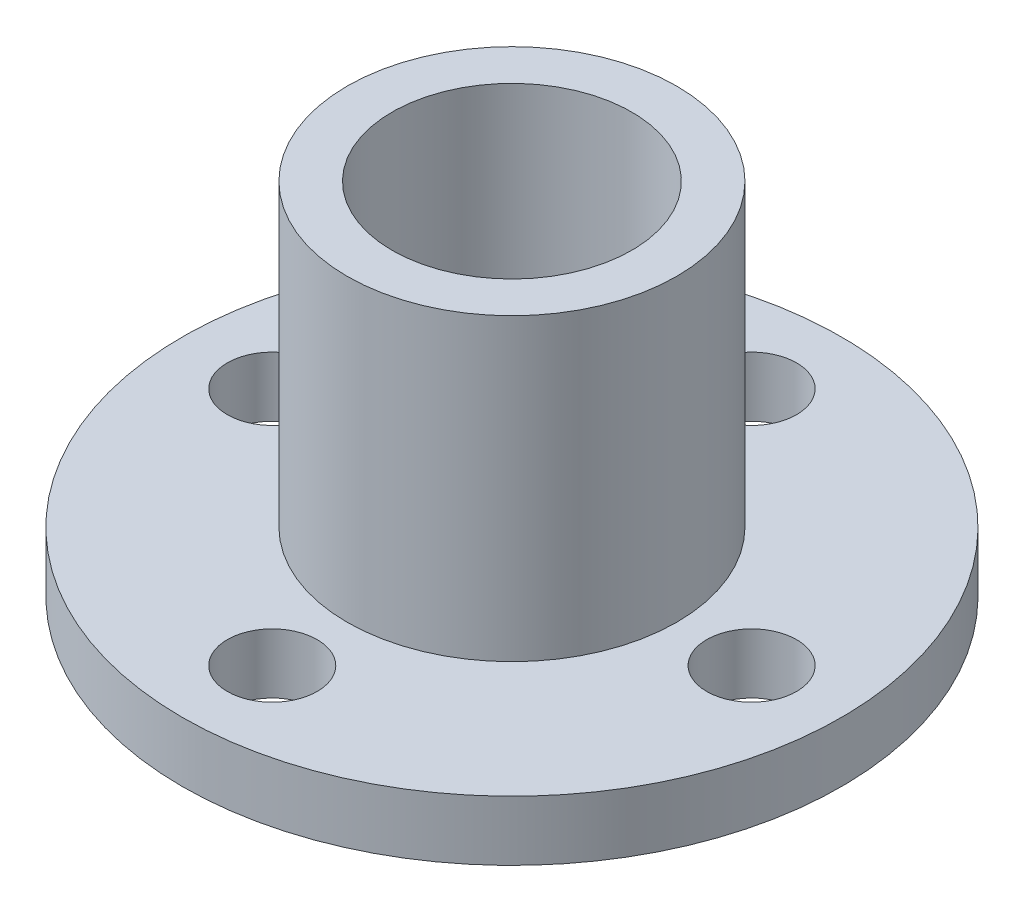
ISO-10303-21;
HEADER;
FILE_DESCRIPTION(('STEP AP214'),'2;1');
FILE_NAME('part.step','',(''),(''),'','','');
FILE_SCHEMA(('AUTOMOTIVE_DESIGN { 1 0 10303 214 1 1 1 1 }'));
ENDSEC;
DATA;
#1=APPLICATION_CONTEXT('core data for automotive mechanical design processes');
#2=APPLICATION_PROTOCOL_DEFINITION('international standard','automotive_design',2000,#1);
#3=PRODUCT_CONTEXT('',#1,'mechanical');
#4=PRODUCT('Part','Part','',(#3));
#5=PRODUCT_RELATED_PRODUCT_CATEGORY('part','',(#4));
#6=PRODUCT_DEFINITION_FORMATION('','',#4);
#7=PRODUCT_DEFINITION_CONTEXT('part definition',#1,'design');
#8=PRODUCT_DEFINITION('design','',#6,#7);
#9=PRODUCT_DEFINITION_SHAPE('','',#8);
#10=(LENGTH_UNIT() NAMED_UNIT(*) SI_UNIT(.MILLI.,.METRE.));
#11=(NAMED_UNIT(*) PLANE_ANGLE_UNIT() SI_UNIT($,.RADIAN.));
#12=(NAMED_UNIT(*) SI_UNIT($,.STERADIAN.) SOLID_ANGLE_UNIT());
#13=UNCERTAINTY_MEASURE_WITH_UNIT(LENGTH_MEASURE(1.E-05),#10,'distance_accuracy_value','');
#14=(GEOMETRIC_REPRESENTATION_CONTEXT(3) GLOBAL_UNCERTAINTY_ASSIGNED_CONTEXT((#13)) GLOBAL_UNIT_ASSIGNED_CONTEXT((#10,
#11,#12)) REPRESENTATION_CONTEXT('',''));
#15=CARTESIAN_POINT('',(0.,0.,0.));
#16=DIRECTION('',(0.,0.,1.));
#17=DIRECTION('',(1.,0.,0.));
#18=AXIS2_PLACEMENT_3D('',#15,#16,#17);
#19=CARTESIAN_POINT('',(0.,2.,0.));
#20=DIRECTION('',(0.,1.,0.));
#21=DIRECTION('',(0.,0.,1.));
#22=AXIS2_PLACEMENT_3D('',#19,#20,#21);
#23=PLANE('',#22);
#24=CARTESIAN_POINT('',(0.,2.,0.));
#25=DIRECTION('',(0.,1.,0.));
#26=DIRECTION('',(0.,0.,1.));
#27=AXIS2_PLACEMENT_3D('',#24,#25,#26);
#28=CIRCLE('',#27,11.);
#29=CARTESIAN_POINT('',(0.,2.,11.));
#30=VERTEX_POINT('',#29);
#31=EDGE_CURVE('E10',#30,#30,#28,.T.);
#32=ORIENTED_EDGE('',*,*,#31,.T.);
#33=EDGE_LOOP('',(#32));
#34=FACE_BOUND('',#33,.T.);
#35=CARTESIAN_POINT('',(8.,2.,0.));
#36=DIRECTION('',(0.,1.,0.));
#37=DIRECTION('',(0.,0.,1.));
#38=AXIS2_PLACEMENT_3D('',#35,#36,#37);
#39=CIRCLE('',#38,1.5);
#40=CARTESIAN_POINT('',(8.,2.,1.5));
#41=VERTEX_POINT('',#40);
#42=EDGE_CURVE('E47',#41,#41,#39,.T.);
#43=ORIENTED_EDGE('',*,*,#42,.F.);
#44=EDGE_LOOP('',(#43));
#45=FACE_BOUND('',#44,.T.);
#46=CARTESIAN_POINT('',(0.,2.,8.));
#47=DIRECTION('',(0.,1.,0.));
#48=DIRECTION('',(0.,0.,1.));
#49=AXIS2_PLACEMENT_3D('',#46,#47,#48);
#50=CIRCLE('',#49,1.5);
#51=CARTESIAN_POINT('',(0.,2.,9.5));
#52=VERTEX_POINT('',#51);
#53=EDGE_CURVE('E53',#52,#52,#50,.T.);
#54=ORIENTED_EDGE('',*,*,#53,.F.);
#55=EDGE_LOOP('',(#54));
#56=FACE_BOUND('',#55,.T.);
#57=CARTESIAN_POINT('',(0.,2.,-8.));
#58=DIRECTION('',(0.,1.,0.));
#59=DIRECTION('',(0.,0.,1.));
#60=AXIS2_PLACEMENT_3D('',#57,#58,#59);
#61=CIRCLE('',#60,1.5);
#62=CARTESIAN_POINT('',(0.,2.,-6.5));
#63=VERTEX_POINT('',#62);
#64=EDGE_CURVE('E60',#63,#63,#61,.T.);
#65=ORIENTED_EDGE('',*,*,#64,.F.);
#66=EDGE_LOOP('',(#65));
#67=FACE_BOUND('',#66,.T.);
#68=CARTESIAN_POINT('',(-8.,2.,0.));
#69=DIRECTION('',(0.,1.,0.));
#70=DIRECTION('',(0.,0.,1.));
#71=AXIS2_PLACEMENT_3D('',#68,#69,#70);
#72=CIRCLE('',#71,1.5);
#73=CARTESIAN_POINT('',(-8.,2.,1.5));
#74=VERTEX_POINT('',#73);
#75=EDGE_CURVE('E66',#74,#74,#72,.T.);
#76=ORIENTED_EDGE('',*,*,#75,.F.);
#77=EDGE_LOOP('',(#76));
#78=FACE_BOUND('',#77,.T.);
#79=CARTESIAN_POINT('',(0.,2.,0.));
#80=DIRECTION('',(0.,1.,0.));
#81=DIRECTION('',(0.,0.,1.));
#82=AXIS2_PLACEMENT_3D('',#79,#80,#81);
#83=CIRCLE('',#82,5.5);
#84=CARTESIAN_POINT('',(0.,2.,5.5));
#85=VERTEX_POINT('',#84);
#86=EDGE_CURVE('E71',#85,#85,#83,.T.);
#87=ORIENTED_EDGE('',*,*,#86,.F.);
#88=EDGE_LOOP('',(#87));
#89=FACE_BOUND('',#88,.T.);
#90=ADVANCED_FACE('F31',(#34,#45,#56,#67,#78,#89),#23,.T.);
#91=CARTESIAN_POINT('',(0.,0.,0.));
#92=DIRECTION('',(0.,1.,0.));
#93=DIRECTION('',(0.,0.,1.));
#94=AXIS2_PLACEMENT_3D('',#91,#92,#93);
#95=PLANE('',#94);
#96=CARTESIAN_POINT('',(-8.,0.,0.));
#97=DIRECTION('',(0.,1.,0.));
#98=DIRECTION('',(0.,0.,1.));
#99=AXIS2_PLACEMENT_3D('',#96,#97,#98);
#100=CIRCLE('',#99,1.5);
#101=CARTESIAN_POINT('',(-8.,0.,1.5));
#102=VERTEX_POINT('',#101);
#103=EDGE_CURVE('E50',#102,#102,#100,.T.);
#104=ORIENTED_EDGE('',*,*,#103,.T.);
#105=EDGE_LOOP('',(#104));
#106=FACE_BOUND('',#105,.T.);
#107=CARTESIAN_POINT('',(0.,0.,-8.));
#108=DIRECTION('',(0.,1.,0.));
#109=DIRECTION('',(0.,0.,1.));
#110=AXIS2_PLACEMENT_3D('',#107,#108,#109);
#111=CIRCLE('',#110,1.5);
#112=CARTESIAN_POINT('',(0.,0.,-6.5));
#113=VERTEX_POINT('',#112);
#114=EDGE_CURVE('E63',#113,#113,#111,.T.);
#115=ORIENTED_EDGE('',*,*,#114,.T.);
#116=EDGE_LOOP('',(#115));
#117=FACE_BOUND('',#116,.T.);
#118=CARTESIAN_POINT('',(0.,0.,8.));
#119=DIRECTION('',(0.,1.,0.));
#120=DIRECTION('',(0.,0.,1.));
#121=AXIS2_PLACEMENT_3D('',#118,#119,#120);
#122=CIRCLE('',#121,1.5);
#123=CARTESIAN_POINT('',(0.,0.,9.5));
#124=VERTEX_POINT('',#123);
#125=EDGE_CURVE('E56',#124,#124,#122,.T.);
#126=ORIENTED_EDGE('',*,*,#125,.T.);
#127=EDGE_LOOP('',(#126));
#128=FACE_BOUND('',#127,.T.);
#129=CARTESIAN_POINT('',(8.,0.,0.));
#130=DIRECTION('',(0.,1.,0.));
#131=DIRECTION('',(0.,0.,1.));
#132=AXIS2_PLACEMENT_3D('',#129,#130,#131);
#133=CIRCLE('',#132,1.5);
#134=CARTESIAN_POINT('',(8.,0.,1.5));
#135=VERTEX_POINT('',#134);
#136=EDGE_CURVE('E46',#135,#135,#133,.T.);
#137=ORIENTED_EDGE('',*,*,#136,.T.);
#138=EDGE_LOOP('',(#137));
#139=FACE_BOUND('',#138,.T.);
#140=CARTESIAN_POINT('',(0.,0.,0.));
#141=DIRECTION('',(0.,1.,0.));
#142=DIRECTION('',(0.,0.,1.));
#143=AXIS2_PLACEMENT_3D('',#140,#141,#142);
#144=CIRCLE('',#143,11.);
#145=CARTESIAN_POINT('',(0.,0.,11.));
#146=VERTEX_POINT('',#145);
#147=EDGE_CURVE('E35',#146,#146,#144,.T.);
#148=ORIENTED_EDGE('',*,*,#147,.F.);
#149=EDGE_LOOP('',(#148));
#150=FACE_BOUND('',#149,.T.);
#151=CARTESIAN_POINT('',(0.,0.,0.));
#152=DIRECTION('',(0.,1.,0.));
#153=DIRECTION('',(0.,0.,1.));
#154=AXIS2_PLACEMENT_3D('',#151,#152,#153);
#155=CIRCLE('',#154,4.);
#156=CARTESIAN_POINT('',(0.,0.,4.));
#157=VERTEX_POINT('',#156);
#158=EDGE_CURVE('E42',#157,#157,#155,.T.);
#159=ORIENTED_EDGE('',*,*,#158,.T.);
#160=EDGE_LOOP('',(#159));
#161=FACE_BOUND('',#160,.T.);
#162=ADVANCED_FACE('F98',(#106,#117,#128,#139,#150,#161),#95,.F.);
#163=CARTESIAN_POINT('',(0.,2.,0.));
#164=DIRECTION('',(0.,-1.,0.));
#165=DIRECTION('',(0.,0.,-1.));
#166=AXIS2_PLACEMENT_3D('',#163,#164,#165);
#167=CYLINDRICAL_SURFACE('',#166,11.);
#168=ORIENTED_EDGE('',*,*,#31,.F.);
#169=EDGE_LOOP('',(#168));
#170=FACE_BOUND('',#169,.T.);
#171=ORIENTED_EDGE('',*,*,#147,.T.);
#172=EDGE_LOOP('',(#171));
#173=FACE_BOUND('',#172,.T.);
#174=ADVANCED_FACE('F33',(#170,#173),#167,.T.);
#175=CARTESIAN_POINT('',(0.,2.,0.));
#176=DIRECTION('',(0.,-1.,0.));
#177=DIRECTION('',(0.,0.,-1.));
#178=AXIS2_PLACEMENT_3D('',#175,#176,#177);
#179=CYLINDRICAL_SURFACE('',#178,4.);
#180=ORIENTED_EDGE('',*,*,#158,.F.);
#181=EDGE_LOOP('',(#180));
#182=FACE_BOUND('',#181,.T.);
#183=CARTESIAN_POINT('',(0.,12.,0.));
#184=DIRECTION('',(0.,1.,0.));
#185=DIRECTION('',(0.,0.,1.));
#186=AXIS2_PLACEMENT_3D('',#183,#184,#185);
#187=CIRCLE('',#186,4.);
#188=CARTESIAN_POINT('',(0.,12.,4.));
#189=VERTEX_POINT('',#188);
#190=EDGE_CURVE('E74',#189,#189,#187,.T.);
#191=ORIENTED_EDGE('',*,*,#190,.T.);
#192=EDGE_LOOP('',(#191));
#193=FACE_BOUND('',#192,.T.);
#194=ADVANCED_FACE('F80',(#182,#193),#179,.F.);
#195=CARTESIAN_POINT('',(8.,0.,0.));
#196=DIRECTION('',(0.,1.,0.));
#197=DIRECTION('',(0.,0.,1.));
#198=AXIS2_PLACEMENT_3D('',#195,#196,#197);
#199=CYLINDRICAL_SURFACE('',#198,1.5);
#200=ORIENTED_EDGE('',*,*,#136,.F.);
#201=EDGE_LOOP('',(#200));
#202=FACE_BOUND('',#201,.T.);
#203=ORIENTED_EDGE('',*,*,#42,.T.);
#204=EDGE_LOOP('',(#203));
#205=FACE_BOUND('',#204,.T.);
#206=ADVANCED_FACE('F108',(#202,#205),#199,.F.);
#207=CARTESIAN_POINT('',(0.,0.,8.));
#208=DIRECTION('',(0.,1.,0.));
#209=DIRECTION('',(0.,0.,1.));
#210=AXIS2_PLACEMENT_3D('',#207,#208,#209);
#211=CYLINDRICAL_SURFACE('',#210,1.5);
#212=ORIENTED_EDGE('',*,*,#125,.F.);
#213=EDGE_LOOP('',(#212));
#214=FACE_BOUND('',#213,.T.);
#215=ORIENTED_EDGE('',*,*,#53,.T.);
#216=EDGE_LOOP('',(#215));
#217=FACE_BOUND('',#216,.T.);
#218=ADVANCED_FACE('F112',(#214,#217),#211,.F.);
#219=CARTESIAN_POINT('',(0.,0.,-8.));
#220=DIRECTION('',(0.,1.,0.));
#221=DIRECTION('',(0.,0.,1.));
#222=AXIS2_PLACEMENT_3D('',#219,#220,#221);
#223=CYLINDRICAL_SURFACE('',#222,1.5);
#224=ORIENTED_EDGE('',*,*,#114,.F.);
#225=EDGE_LOOP('',(#224));
#226=FACE_BOUND('',#225,.T.);
#227=ORIENTED_EDGE('',*,*,#64,.T.);
#228=EDGE_LOOP('',(#227));
#229=FACE_BOUND('',#228,.T.);
#230=ADVANCED_FACE('F94',(#226,#229),#223,.F.);
#231=CARTESIAN_POINT('',(-8.,0.,0.));
#232=DIRECTION('',(0.,1.,0.));
#233=DIRECTION('',(0.,0.,1.));
#234=AXIS2_PLACEMENT_3D('',#231,#232,#233);
#235=CYLINDRICAL_SURFACE('',#234,1.5);
#236=ORIENTED_EDGE('',*,*,#103,.F.);
#237=EDGE_LOOP('',(#236));
#238=FACE_BOUND('',#237,.T.);
#239=ORIENTED_EDGE('',*,*,#75,.T.);
#240=EDGE_LOOP('',(#239));
#241=FACE_BOUND('',#240,.T.);
#242=ADVANCED_FACE('F85',(#238,#241),#235,.F.);
#243=CARTESIAN_POINT('',(0.,12.,0.));
#244=DIRECTION('',(0.,1.,0.));
#245=DIRECTION('',(0.,0.,1.));
#246=AXIS2_PLACEMENT_3D('',#243,#244,#245);
#247=PLANE('',#246);
#248=CARTESIAN_POINT('',(0.,12.,0.));
#249=DIRECTION('',(0.,1.,0.));
#250=DIRECTION('',(0.,0.,1.));
#251=AXIS2_PLACEMENT_3D('',#248,#249,#250);
#252=CIRCLE('',#251,5.5);
#253=CARTESIAN_POINT('',(0.,12.,5.5));
#254=VERTEX_POINT('',#253);
#255=EDGE_CURVE('E57',#254,#254,#252,.T.);
#256=ORIENTED_EDGE('',*,*,#255,.T.);
#257=EDGE_LOOP('',(#256));
#258=FACE_BOUND('',#257,.T.);
#259=ORIENTED_EDGE('',*,*,#190,.F.);
#260=EDGE_LOOP('',(#259));
#261=FACE_BOUND('',#260,.T.);
#262=ADVANCED_FACE('F82',(#258,#261),#247,.T.);
#263=CARTESIAN_POINT('',(0.,12.,0.));
#264=DIRECTION('',(0.,-1.,0.));
#265=DIRECTION('',(0.,0.,-1.));
#266=AXIS2_PLACEMENT_3D('',#263,#264,#265);
#267=CYLINDRICAL_SURFACE('',#266,5.5);
#268=ORIENTED_EDGE('',*,*,#255,.F.);
#269=EDGE_LOOP('',(#268));
#270=FACE_BOUND('',#269,.T.);
#271=ORIENTED_EDGE('',*,*,#86,.T.);
#272=EDGE_LOOP('',(#271));
#273=FACE_BOUND('',#272,.T.);
#274=ADVANCED_FACE('F84',(#270,#273),#267,.T.);
#275=CLOSED_SHELL('',(#90,#162,#174,#194,#206,#218,#230,#242,#262,#274));
#276=MANIFOLD_SOLID_BREP('B2',#275);
#277=ADVANCED_BREP_SHAPE_REPRESENTATION('',(#18,#276),#14);
#278=SHAPE_DEFINITION_REPRESENTATION(#9,#277);
ENDSEC;
END-ISO-10303-21;
